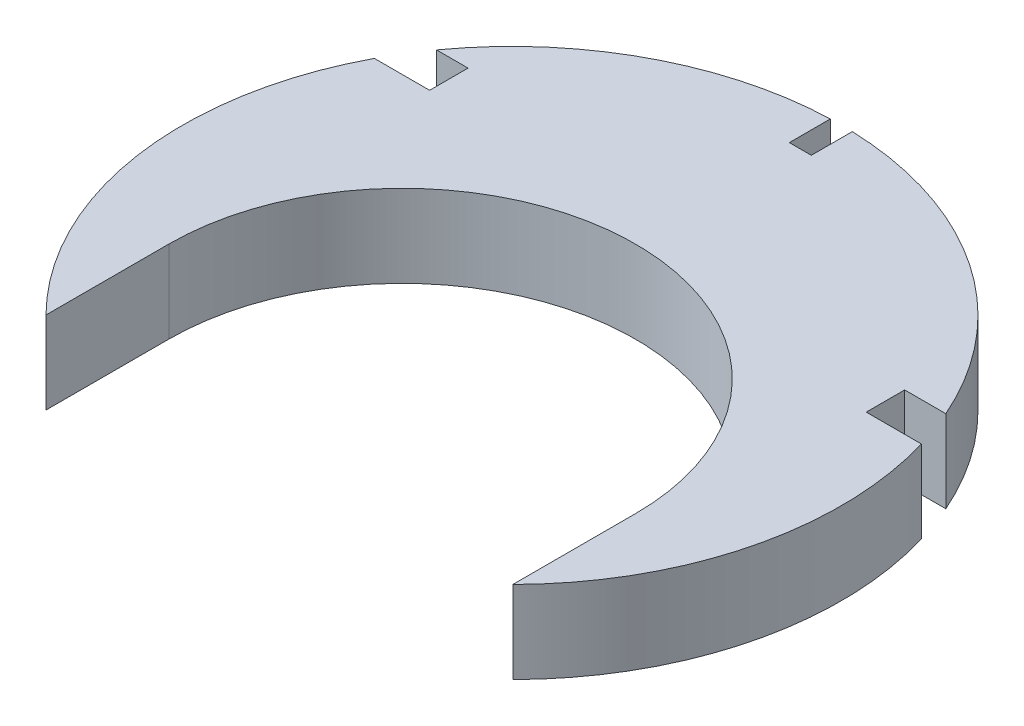
ISO-10303-21;
HEADER;
FILE_DESCRIPTION(('STEP AP214'),'2;1');
FILE_NAME('part.step','',(''),(''),'','','');
FILE_SCHEMA(('AUTOMOTIVE_DESIGN { 1 0 10303 214 1 1 1 1 }'));
ENDSEC;
DATA;
#1=APPLICATION_CONTEXT('core data for automotive mechanical design processes');
#2=APPLICATION_PROTOCOL_DEFINITION('international standard','automotive_design',2000,#1);
#3=PRODUCT_CONTEXT('',#1,'mechanical');
#4=PRODUCT('Part','Part','',(#3));
#5=PRODUCT_RELATED_PRODUCT_CATEGORY('part','',(#4));
#6=PRODUCT_DEFINITION_FORMATION('','',#4);
#7=PRODUCT_DEFINITION_CONTEXT('part definition',#1,'design');
#8=PRODUCT_DEFINITION('design','',#6,#7);
#9=PRODUCT_DEFINITION_SHAPE('','',#8);
#10=(LENGTH_UNIT() NAMED_UNIT(*) SI_UNIT(.MILLI.,.METRE.));
#11=(NAMED_UNIT(*) PLANE_ANGLE_UNIT() SI_UNIT($,.RADIAN.));
#12=(NAMED_UNIT(*) SI_UNIT($,.STERADIAN.) SOLID_ANGLE_UNIT());
#13=UNCERTAINTY_MEASURE_WITH_UNIT(LENGTH_MEASURE(1.E-05),#10,'distance_accuracy_value','');
#14=(GEOMETRIC_REPRESENTATION_CONTEXT(3) GLOBAL_UNCERTAINTY_ASSIGNED_CONTEXT((#13)) GLOBAL_UNIT_ASSIGNED_CONTEXT((#10,
#11,#12)) REPRESENTATION_CONTEXT('',''));
#15=CARTESIAN_POINT('',(0.,0.,0.));
#16=DIRECTION('',(0.,0.,1.));
#17=DIRECTION('',(1.,0.,0.));
#18=AXIS2_PLACEMENT_3D('',#15,#16,#17);
#19=CARTESIAN_POINT('',(0.,6.6,0.));
#20=DIRECTION('',(0.,-1.,0.));
#21=DIRECTION('',(0.,0.,-1.));
#22=AXIS2_PLACEMENT_3D('',#19,#20,#21);
#23=CYLINDRICAL_SURFACE('',#22,12.);
#24=CARTESIAN_POINT('',(0.,3.6,0.));
#25=DIRECTION('',(0.,1.,0.));
#26=DIRECTION('',(0.,0.,1.));
#27=AXIS2_PLACEMENT_3D('',#24,#25,#26);
#28=CIRCLE('',#27,12.);
#29=CARTESIAN_POINT('',(10.998181667894,3.6,-4.8));
#30=VERTEX_POINT('',#29);
#31=CARTESIAN_POINT('',(0.400000000000038,3.6,-11.993331480452));
#32=VERTEX_POINT('',#31);
#33=EDGE_CURVE('E179',#30,#32,#28,.T.);
#34=ORIENTED_EDGE('',*,*,#33,.T.);
#35=DIRECTION('',(0.,-1.,0.));
#36=VECTOR('',#35,1.);
#37=CARTESIAN_POINT('',(0.400000000000038,6.6,-11.993331480452));
#38=LINE('',#37,#36);
#39=CARTESIAN_POINT('',(0.400000000000038,6.6,-11.993331480452));
#40=VERTEX_POINT('',#39);
#41=EDGE_CURVE('E11',#40,#32,#38,.T.);
#42=ORIENTED_EDGE('',*,*,#41,.F.);
#43=CARTESIAN_POINT('',(0.,6.6,0.));
#44=DIRECTION('',(0.,1.,0.));
#45=DIRECTION('',(0.,0.,1.));
#46=AXIS2_PLACEMENT_3D('',#43,#44,#45);
#47=CIRCLE('',#46,12.);
#48=CARTESIAN_POINT('',(10.998181667894,6.6,-4.8));
#49=VERTEX_POINT('',#48);
#50=EDGE_CURVE('E215',#49,#40,#47,.T.);
#51=ORIENTED_EDGE('',*,*,#50,.F.);
#52=DIRECTION('',(0.,-1.,0.));
#53=VECTOR('',#52,1.);
#54=CARTESIAN_POINT('',(10.998181667894,6.6,-4.8));
#55=LINE('',#54,#53);
#56=EDGE_CURVE('E175',#49,#30,#55,.T.);
#57=ORIENTED_EDGE('',*,*,#56,.T.);
#58=EDGE_LOOP('',(#34,#42,#51,#57));
#59=FACE_BOUND('',#58,.T.);
#60=ADVANCED_FACE('F35',(#59),#23,.T.);
#61=CARTESIAN_POINT('',(0.400000000000038,6.6,0.));
#62=DIRECTION('',(1.,0.,0.));
#63=DIRECTION('',(0.,0.,-1.));
#64=AXIS2_PLACEMENT_3D('',#61,#62,#63);
#65=PLANE('',#64);
#66=DIRECTION('',(0.,0.,1.));
#67=VECTOR('',#66,1.);
#68=CARTESIAN_POINT('',(0.400000000000038,3.6,0.));
#69=LINE('',#68,#67);
#70=CARTESIAN_POINT('',(0.400000000000038,3.6,-10.5));
#71=VERTEX_POINT('',#70);
#72=EDGE_CURVE('E182',#32,#71,#69,.T.);
#73=ORIENTED_EDGE('',*,*,#72,.T.);
#74=DIRECTION('',(0.,-1.,0.));
#75=VECTOR('',#74,1.);
#76=CARTESIAN_POINT('',(0.400000000000038,6.6,-10.5));
#77=LINE('',#76,#75);
#78=CARTESIAN_POINT('',(0.400000000000038,6.6,-10.5));
#79=VERTEX_POINT('',#78);
#80=EDGE_CURVE('E43',#79,#71,#77,.T.);
#81=ORIENTED_EDGE('',*,*,#80,.F.);
#82=DIRECTION('',(0.,0.,1.));
#83=VECTOR('',#82,1.);
#84=CARTESIAN_POINT('',(0.400000000000038,6.6,0.));
#85=LINE('',#84,#83);
#86=EDGE_CURVE('E118',#40,#79,#85,.T.);
#87=ORIENTED_EDGE('',*,*,#86,.F.);
#88=ORIENTED_EDGE('',*,*,#41,.T.);
#89=EDGE_LOOP('',(#73,#81,#87,#88));
#90=FACE_BOUND('',#89,.T.);
#91=ADVANCED_FACE('F248',(#90),#65,.F.);
#92=CARTESIAN_POINT('',(0.,6.6,-10.5));
#93=DIRECTION('',(0.,0.,-1.));
#94=DIRECTION('',(-1.,0.,0.));
#95=AXIS2_PLACEMENT_3D('',#92,#93,#94);
#96=PLANE('',#95);
#97=DIRECTION('',(1.,0.,0.));
#98=VECTOR('',#97,1.);
#99=CARTESIAN_POINT('',(0.,3.6,-10.5));
#100=LINE('',#99,#98);
#101=CARTESIAN_POINT('',(-0.399999999999965,3.6,-10.5));
#102=VERTEX_POINT('',#101);
#103=EDGE_CURVE('E185',#102,#71,#100,.T.);
#104=ORIENTED_EDGE('',*,*,#103,.F.);
#105=DIRECTION('',(0.,-1.,0.));
#106=VECTOR('',#105,1.);
#107=CARTESIAN_POINT('',(-0.399999999999965,6.6,-10.5));
#108=LINE('',#107,#106);
#109=CARTESIAN_POINT('',(-0.399999999999965,6.6,-10.5));
#110=VERTEX_POINT('',#109);
#111=EDGE_CURVE('E241',#110,#102,#108,.T.);
#112=ORIENTED_EDGE('',*,*,#111,.F.);
#113=DIRECTION('',(1.,0.,0.));
#114=VECTOR('',#113,1.);
#115=CARTESIAN_POINT('',(0.,6.6,-10.5));
#116=LINE('',#115,#114);
#117=EDGE_CURVE('E247',#110,#79,#116,.T.);
#118=ORIENTED_EDGE('',*,*,#117,.T.);
#119=ORIENTED_EDGE('',*,*,#80,.T.);
#120=EDGE_LOOP('',(#104,#112,#118,#119));
#121=FACE_BOUND('',#120,.T.);
#122=ADVANCED_FACE('F245',(#121),#96,.T.);
#123=CARTESIAN_POINT('',(-0.399999999999965,6.6,0.));
#124=DIRECTION('',(-1.,0.,0.));
#125=DIRECTION('',(0.,0.,1.));
#126=AXIS2_PLACEMENT_3D('',#123,#124,#125);
#127=PLANE('',#126);
#128=DIRECTION('',(0.,0.,-1.));
#129=VECTOR('',#128,1.);
#130=CARTESIAN_POINT('',(-0.399999999999965,3.6,0.));
#131=LINE('',#130,#129);
#132=CARTESIAN_POINT('',(-0.399999999999965,3.6,-11.993331480452));
#133=VERTEX_POINT('',#132);
#134=EDGE_CURVE('E188',#102,#133,#131,.T.);
#135=ORIENTED_EDGE('',*,*,#134,.T.);
#136=DIRECTION('',(0.,-1.,0.));
#137=VECTOR('',#136,1.);
#138=CARTESIAN_POINT('',(-0.399999999999965,6.6,-11.993331480452));
#139=LINE('',#138,#137);
#140=CARTESIAN_POINT('',(-0.399999999999965,6.6,-11.993331480452));
#141=VERTEX_POINT('',#140);
#142=EDGE_CURVE('E238',#141,#133,#139,.T.);
#143=ORIENTED_EDGE('',*,*,#142,.F.);
#144=DIRECTION('',(0.,0.,-1.));
#145=VECTOR('',#144,1.);
#146=CARTESIAN_POINT('',(-0.399999999999965,6.6,0.));
#147=LINE('',#146,#145);
#148=EDGE_CURVE('E267',#110,#141,#147,.T.);
#149=ORIENTED_EDGE('',*,*,#148,.F.);
#150=ORIENTED_EDGE('',*,*,#111,.T.);
#151=EDGE_LOOP('',(#135,#143,#149,#150));
#152=FACE_BOUND('',#151,.T.);
#153=ADVANCED_FACE('F257',(#152),#127,.F.);
#154=CARTESIAN_POINT('',(0.,6.6,0.));
#155=DIRECTION('',(0.,-1.,0.));
#156=DIRECTION('',(0.,0.,-1.));
#157=AXIS2_PLACEMENT_3D('',#154,#155,#156);
#158=CYLINDRICAL_SURFACE('',#157,12.);
#159=CARTESIAN_POINT('',(0.,3.6,0.));
#160=DIRECTION('',(0.,1.,0.));
#161=DIRECTION('',(0.,0.,1.));
#162=AXIS2_PLACEMENT_3D('',#159,#160,#161);
#163=CIRCLE('',#162,12.);
#164=CARTESIAN_POINT('',(-9.74679434480893,3.6,-7.));
#165=VERTEX_POINT('',#164);
#166=EDGE_CURVE('E190',#133,#165,#163,.T.);
#167=ORIENTED_EDGE('',*,*,#166,.T.);
#168=DIRECTION('',(0.,-1.,0.));
#169=VECTOR('',#168,1.);
#170=CARTESIAN_POINT('',(-9.74679434480893,6.6,-7.));
#171=LINE('',#170,#169);
#172=CARTESIAN_POINT('',(-9.74679434480893,6.6,-7.));
#173=VERTEX_POINT('',#172);
#174=EDGE_CURVE('E236',#173,#165,#171,.T.);
#175=ORIENTED_EDGE('',*,*,#174,.F.);
#176=CARTESIAN_POINT('',(0.,6.6,0.));
#177=DIRECTION('',(0.,1.,0.));
#178=DIRECTION('',(0.,0.,1.));
#179=AXIS2_PLACEMENT_3D('',#176,#177,#178);
#180=CIRCLE('',#179,12.);
#181=EDGE_CURVE('E263',#141,#173,#180,.T.);
#182=ORIENTED_EDGE('',*,*,#181,.F.);
#183=ORIENTED_EDGE('',*,*,#142,.T.);
#184=EDGE_LOOP('',(#167,#175,#182,#183));
#185=FACE_BOUND('',#184,.T.);
#186=ADVANCED_FACE('F261',(#185),#158,.T.);
#187=CARTESIAN_POINT('',(0.,6.6,-7.));
#188=DIRECTION('',(0.,0.,1.));
#189=DIRECTION('',(1.,0.,0.));
#190=AXIS2_PLACEMENT_3D('',#187,#188,#189);
#191=PLANE('',#190);
#192=DIRECTION('',(-1.,0.,0.));
#193=VECTOR('',#192,1.);
#194=CARTESIAN_POINT('',(0.,3.6,-7.));
#195=LINE('',#194,#193);
#196=CARTESIAN_POINT('',(-8.59999999999997,3.6,-7.));
#197=VERTEX_POINT('',#196);
#198=EDGE_CURVE('E193',#197,#165,#195,.T.);
#199=ORIENTED_EDGE('',*,*,#198,.F.);
#200=DIRECTION('',(0.,-1.,0.));
#201=VECTOR('',#200,1.);
#202=CARTESIAN_POINT('',(-8.59999999999997,6.6,-7.));
#203=LINE('',#202,#201);
#204=CARTESIAN_POINT('',(-8.59999999999997,6.6,-7.));
#205=VERTEX_POINT('',#204);
#206=EDGE_CURVE('E234',#205,#197,#203,.T.);
#207=ORIENTED_EDGE('',*,*,#206,.F.);
#208=DIRECTION('',(-1.,0.,0.));
#209=VECTOR('',#208,1.);
#210=CARTESIAN_POINT('',(0.,6.6,-7.));
#211=LINE('',#210,#209);
#212=EDGE_CURVE('E266',#205,#173,#211,.T.);
#213=ORIENTED_EDGE('',*,*,#212,.T.);
#214=ORIENTED_EDGE('',*,*,#174,.T.);
#215=EDGE_LOOP('',(#199,#207,#213,#214));
#216=FACE_BOUND('',#215,.T.);
#217=ADVANCED_FACE('F320',(#216),#191,.T.);
#218=CARTESIAN_POINT('',(-8.59999999999997,6.6,0.));
#219=DIRECTION('',(1.,0.,0.));
#220=DIRECTION('',(0.,0.,-1.));
#221=AXIS2_PLACEMENT_3D('',#218,#219,#220);
#222=PLANE('',#221);
#223=DIRECTION('',(0.,0.,1.));
#224=VECTOR('',#223,1.);
#225=CARTESIAN_POINT('',(-8.59999999999997,3.6,0.));
#226=LINE('',#225,#224);
#227=CARTESIAN_POINT('',(-8.59999999999997,3.6,-5.6));
#228=VERTEX_POINT('',#227);
#229=EDGE_CURVE('E196',#197,#228,#226,.T.);
#230=ORIENTED_EDGE('',*,*,#229,.T.);
#231=DIRECTION('',(0.,-1.,0.));
#232=VECTOR('',#231,1.);
#233=CARTESIAN_POINT('',(-8.59999999999997,6.6,-5.6));
#234=LINE('',#233,#232);
#235=CARTESIAN_POINT('',(-8.59999999999997,6.6,-5.6));
#236=VERTEX_POINT('',#235);
#237=EDGE_CURVE('E231',#236,#228,#234,.T.);
#238=ORIENTED_EDGE('',*,*,#237,.F.);
#239=DIRECTION('',(0.,0.,1.));
#240=VECTOR('',#239,1.);
#241=CARTESIAN_POINT('',(-8.59999999999997,6.6,0.));
#242=LINE('',#241,#240);
#243=EDGE_CURVE('E269',#205,#236,#242,.T.);
#244=ORIENTED_EDGE('',*,*,#243,.F.);
#245=ORIENTED_EDGE('',*,*,#206,.T.);
#246=EDGE_LOOP('',(#230,#238,#244,#245));
#247=FACE_BOUND('',#246,.T.);
#248=ADVANCED_FACE('F323',(#247),#222,.F.);
#249=CARTESIAN_POINT('',(0.,6.6,-5.6));
#250=DIRECTION('',(0.,0.,1.));
#251=DIRECTION('',(1.,0.,0.));
#252=AXIS2_PLACEMENT_3D('',#249,#250,#251);
#253=PLANE('',#252);
#254=DIRECTION('',(-1.,0.,0.));
#255=VECTOR('',#254,1.);
#256=CARTESIAN_POINT('',(0.,3.6,-5.6));
#257=LINE('',#256,#255);
#258=CARTESIAN_POINT('',(-10.6131993291373,3.6,-5.6));
#259=VERTEX_POINT('',#258);
#260=EDGE_CURVE('E198',#228,#259,#257,.T.);
#261=ORIENTED_EDGE('',*,*,#260,.T.);
#262=DIRECTION('',(0.,-1.,0.));
#263=VECTOR('',#262,1.);
#264=CARTESIAN_POINT('',(-10.6131993291373,6.6,-5.6));
#265=LINE('',#264,#263);
#266=CARTESIAN_POINT('',(-10.6131993291373,6.6,-5.6));
#267=VERTEX_POINT('',#266);
#268=EDGE_CURVE('E228',#267,#259,#265,.T.);
#269=ORIENTED_EDGE('',*,*,#268,.F.);
#270=DIRECTION('',(-1.,0.,0.));
#271=VECTOR('',#270,1.);
#272=CARTESIAN_POINT('',(0.,6.6,-5.6));
#273=LINE('',#272,#271);
#274=EDGE_CURVE('E275',#236,#267,#273,.T.);
#275=ORIENTED_EDGE('',*,*,#274,.F.);
#276=ORIENTED_EDGE('',*,*,#237,.T.);
#277=EDGE_LOOP('',(#261,#269,#275,#276));
#278=FACE_BOUND('',#277,.T.);
#279=ADVANCED_FACE('F327',(#278),#253,.F.);
#280=CARTESIAN_POINT('',(0.,6.6,0.));
#281=DIRECTION('',(0.,-1.,0.));
#282=DIRECTION('',(0.,0.,-1.));
#283=AXIS2_PLACEMENT_3D('',#280,#281,#282);
#284=CYLINDRICAL_SURFACE('',#283,12.);
#285=CARTESIAN_POINT('',(0.,3.6,0.));
#286=DIRECTION('',(0.,1.,0.));
#287=DIRECTION('',(0.,0.,1.));
#288=AXIS2_PLACEMENT_3D('',#285,#286,#287);
#289=CIRCLE('',#288,12.);
#290=CARTESIAN_POINT('',(-8.49999999999999,3.6,8.47053717304876));
#291=VERTEX_POINT('',#290);
#292=EDGE_CURVE('E200',#259,#291,#289,.T.);
#293=ORIENTED_EDGE('',*,*,#292,.T.);
#294=DIRECTION('',(0.,-1.,0.));
#295=VECTOR('',#294,1.);
#296=CARTESIAN_POINT('',(-8.49999999999999,6.6,8.47053717304876));
#297=LINE('',#296,#295);
#298=CARTESIAN_POINT('',(-8.49999999999999,6.6,8.47053717304876));
#299=VERTEX_POINT('',#298);
#300=EDGE_CURVE('E226',#299,#291,#297,.T.);
#301=ORIENTED_EDGE('',*,*,#300,.F.);
#302=CARTESIAN_POINT('',(0.,6.6,0.));
#303=DIRECTION('',(0.,1.,0.));
#304=DIRECTION('',(0.,0.,1.));
#305=AXIS2_PLACEMENT_3D('',#302,#303,#304);
#306=CIRCLE('',#305,12.);
#307=EDGE_CURVE('E277',#267,#299,#306,.T.);
#308=ORIENTED_EDGE('',*,*,#307,.F.);
#309=ORIENTED_EDGE('',*,*,#268,.T.);
#310=EDGE_LOOP('',(#293,#301,#308,#309));
#311=FACE_BOUND('',#310,.T.);
#312=ADVANCED_FACE('F331',(#311),#284,.T.);
#313=CARTESIAN_POINT('',(-8.49999999999999,6.6,0.));
#314=DIRECTION('',(1.,0.,0.));
#315=DIRECTION('',(0.,0.,-1.));
#316=AXIS2_PLACEMENT_3D('',#313,#314,#315);
#317=PLANE('',#316);
#318=DIRECTION('',(0.,0.,1.));
#319=VECTOR('',#318,1.);
#320=CARTESIAN_POINT('',(-8.49999999999999,3.6,0.));
#321=LINE('',#320,#319);
#322=CARTESIAN_POINT('',(-8.49999999999999,3.6,4.));
#323=VERTEX_POINT('',#322);
#324=EDGE_CURVE('E203',#323,#291,#321,.T.);
#325=ORIENTED_EDGE('',*,*,#324,.F.);
#326=DIRECTION('',(0.,-1.,0.));
#327=VECTOR('',#326,1.);
#328=CARTESIAN_POINT('',(-8.49999999999999,6.6,4.));
#329=LINE('',#328,#327);
#330=CARTESIAN_POINT('',(-8.49999999999999,6.6,4.));
#331=VERTEX_POINT('',#330);
#332=EDGE_CURVE('E224',#331,#323,#329,.T.);
#333=ORIENTED_EDGE('',*,*,#332,.F.);
#334=DIRECTION('',(0.,0.,1.));
#335=VECTOR('',#334,1.);
#336=CARTESIAN_POINT('',(-8.49999999999999,6.6,0.));
#337=LINE('',#336,#335);
#338=EDGE_CURVE('E279',#331,#299,#337,.T.);
#339=ORIENTED_EDGE('',*,*,#338,.T.);
#340=ORIENTED_EDGE('',*,*,#300,.T.);
#341=EDGE_LOOP('',(#325,#333,#339,#340));
#342=FACE_BOUND('',#341,.T.);
#343=ADVANCED_FACE('F333',(#342),#317,.T.);
#344=CARTESIAN_POINT('',(0.,6.6,4.));
#345=DIRECTION('',(0.,-1.,0.));
#346=DIRECTION('',(0.,0.,-1.));
#347=AXIS2_PLACEMENT_3D('',#344,#345,#346);
#348=CYLINDRICAL_SURFACE('',#347,8.5);
#349=CARTESIAN_POINT('',(0.,3.6,4.));
#350=DIRECTION('',(0.,1.,0.));
#351=DIRECTION('',(0.,0.,1.));
#352=AXIS2_PLACEMENT_3D('',#349,#350,#351);
#353=CIRCLE('',#352,8.5);
#354=CARTESIAN_POINT('',(8.50000000000001,3.6,4.));
#355=VERTEX_POINT('',#354);
#356=EDGE_CURVE('E207',#355,#323,#353,.T.);
#357=ORIENTED_EDGE('',*,*,#356,.F.);
#358=DIRECTION('',(0.,-1.,0.));
#359=VECTOR('',#358,1.);
#360=CARTESIAN_POINT('',(8.50000000000001,6.6,4.));
#361=LINE('',#360,#359);
#362=CARTESIAN_POINT('',(8.50000000000001,6.6,4.));
#363=VERTEX_POINT('',#362);
#364=EDGE_CURVE('E222',#363,#355,#361,.T.);
#365=ORIENTED_EDGE('',*,*,#364,.F.);
#366=CARTESIAN_POINT('',(0.,6.6,4.));
#367=DIRECTION('',(0.,1.,0.));
#368=DIRECTION('',(0.,0.,1.));
#369=AXIS2_PLACEMENT_3D('',#366,#367,#368);
#370=CIRCLE('',#369,8.5);
#371=EDGE_CURVE('E282',#363,#331,#370,.T.);
#372=ORIENTED_EDGE('',*,*,#371,.T.);
#373=ORIENTED_EDGE('',*,*,#332,.T.);
#374=EDGE_LOOP('',(#357,#365,#372,#373));
#375=FACE_BOUND('',#374,.T.);
#376=ADVANCED_FACE('F336',(#375),#348,.F.);
#377=CARTESIAN_POINT('',(8.50000000000001,6.6,0.));
#378=DIRECTION('',(1.,0.,0.));
#379=DIRECTION('',(0.,0.,-1.));
#380=AXIS2_PLACEMENT_3D('',#377,#378,#379);
#381=PLANE('',#380);
#382=DIRECTION('',(0.,0.,1.));
#383=VECTOR('',#382,1.);
#384=CARTESIAN_POINT('',(8.50000000000001,3.6,0.));
#385=LINE('',#384,#383);
#386=CARTESIAN_POINT('',(8.50000000000001,3.6,8.47053717304875));
#387=VERTEX_POINT('',#386);
#388=EDGE_CURVE('E210',#355,#387,#385,.T.);
#389=ORIENTED_EDGE('',*,*,#388,.T.);
#390=DIRECTION('',(0.,-1.,0.));
#391=VECTOR('',#390,1.);
#392=CARTESIAN_POINT('',(8.50000000000001,6.6,8.47053717304875));
#393=LINE('',#392,#391);
#394=CARTESIAN_POINT('',(8.50000000000001,6.6,8.47053717304875));
#395=VERTEX_POINT('',#394);
#396=EDGE_CURVE('E219',#395,#387,#393,.T.);
#397=ORIENTED_EDGE('',*,*,#396,.F.);
#398=DIRECTION('',(0.,0.,1.));
#399=VECTOR('',#398,1.);
#400=CARTESIAN_POINT('',(8.50000000000001,6.6,0.));
#401=LINE('',#400,#399);
#402=EDGE_CURVE('E284',#363,#395,#401,.T.);
#403=ORIENTED_EDGE('',*,*,#402,.F.);
#404=ORIENTED_EDGE('',*,*,#364,.T.);
#405=EDGE_LOOP('',(#389,#397,#403,#404));
#406=FACE_BOUND('',#405,.T.);
#407=ADVANCED_FACE('F290',(#406),#381,.F.);
#408=CARTESIAN_POINT('',(11.5082579046527,3.6,-3.4));
#409=VERTEX_POINT('',#408);
#410=EDGE_CURVE('E204',#387,#409,#289,.T.);
#411=ORIENTED_EDGE('',*,*,#410,.T.);
#412=DIRECTION('',(0.,-1.,0.));
#413=VECTOR('',#412,1.);
#414=CARTESIAN_POINT('',(11.5082579046527,6.6,-3.4));
#415=LINE('',#414,#413);
#416=CARTESIAN_POINT('',(11.5082579046527,6.6,-3.4));
#417=VERTEX_POINT('',#416);
#418=EDGE_CURVE('E170',#417,#409,#415,.T.);
#419=ORIENTED_EDGE('',*,*,#418,.F.);
#420=EDGE_CURVE('E161',#395,#417,#306,.T.);
#421=ORIENTED_EDGE('',*,*,#420,.F.);
#422=ORIENTED_EDGE('',*,*,#396,.T.);
#423=EDGE_LOOP('',(#411,#419,#421,#422));
#424=FACE_BOUND('',#423,.T.);
#425=ADVANCED_FACE('F294',(#424),#284,.T.);
#426=CARTESIAN_POINT('',(0.,6.6,-3.4));
#427=DIRECTION('',(0.,0.,1.));
#428=DIRECTION('',(1.,0.,0.));
#429=AXIS2_PLACEMENT_3D('',#426,#427,#428);
#430=PLANE('',#429);
#431=DIRECTION('',(-1.,0.,0.));
#432=VECTOR('',#431,1.);
#433=CARTESIAN_POINT('',(0.,3.6,-3.4));
#434=LINE('',#433,#432);
#435=CARTESIAN_POINT('',(9.50000000000004,3.6,-3.4));
#436=VERTEX_POINT('',#435);
#437=EDGE_CURVE('E169',#409,#436,#434,.T.);
#438=ORIENTED_EDGE('',*,*,#437,.T.);
#439=DIRECTION('',(0.,-1.,0.));
#440=VECTOR('',#439,1.);
#441=CARTESIAN_POINT('',(9.50000000000004,6.6,-3.4));
#442=LINE('',#441,#440);
#443=CARTESIAN_POINT('',(9.50000000000004,6.6,-3.4));
#444=VERTEX_POINT('',#443);
#445=EDGE_CURVE('E166',#444,#436,#442,.T.);
#446=ORIENTED_EDGE('',*,*,#445,.F.);
#447=DIRECTION('',(-1.,0.,0.));
#448=VECTOR('',#447,1.);
#449=CARTESIAN_POINT('',(0.,6.6,-3.4));
#450=LINE('',#449,#448);
#451=EDGE_CURVE('E155',#417,#444,#450,.T.);
#452=ORIENTED_EDGE('',*,*,#451,.F.);
#453=ORIENTED_EDGE('',*,*,#418,.T.);
#454=EDGE_LOOP('',(#438,#446,#452,#453));
#455=FACE_BOUND('',#454,.T.);
#456=ADVANCED_FACE('F167',(#455),#430,.F.);
#457=CARTESIAN_POINT('',(9.50000000000004,6.6,0.));
#458=DIRECTION('',(-1.,0.,0.));
#459=DIRECTION('',(0.,0.,1.));
#460=AXIS2_PLACEMENT_3D('',#457,#458,#459);
#461=PLANE('',#460);
#462=DIRECTION('',(0.,0.,-1.));
#463=VECTOR('',#462,1.);
#464=CARTESIAN_POINT('',(9.50000000000004,3.6,0.));
#465=LINE('',#464,#463);
#466=CARTESIAN_POINT('',(9.50000000000004,3.6,-4.8));
#467=VERTEX_POINT('',#466);
#468=EDGE_CURVE('E104',#436,#467,#465,.T.);
#469=ORIENTED_EDGE('',*,*,#468,.T.);
#470=DIRECTION('',(0.,-1.,0.));
#471=VECTOR('',#470,1.);
#472=CARTESIAN_POINT('',(9.50000000000004,6.6,-4.8));
#473=LINE('',#472,#471);
#474=CARTESIAN_POINT('',(9.50000000000004,6.6,-4.8));
#475=VERTEX_POINT('',#474);
#476=EDGE_CURVE('E171',#475,#467,#473,.T.);
#477=ORIENTED_EDGE('',*,*,#476,.F.);
#478=DIRECTION('',(0.,0.,-1.));
#479=VECTOR('',#478,1.);
#480=CARTESIAN_POINT('',(9.50000000000004,6.6,0.));
#481=LINE('',#480,#479);
#482=EDGE_CURVE('E159',#444,#475,#481,.T.);
#483=ORIENTED_EDGE('',*,*,#482,.F.);
#484=ORIENTED_EDGE('',*,*,#445,.T.);
#485=EDGE_LOOP('',(#469,#477,#483,#484));
#486=FACE_BOUND('',#485,.T.);
#487=ADVANCED_FACE('F173',(#486),#461,.F.);
#488=CARTESIAN_POINT('',(0.,6.6,-4.8));
#489=DIRECTION('',(0.,0.,-1.));
#490=DIRECTION('',(-1.,0.,0.));
#491=AXIS2_PLACEMENT_3D('',#488,#489,#490);
#492=PLANE('',#491);
#493=DIRECTION('',(1.,0.,0.));
#494=VECTOR('',#493,1.);
#495=CARTESIAN_POINT('',(0.,3.6,-4.8));
#496=LINE('',#495,#494);
#497=EDGE_CURVE('E110',#467,#30,#496,.T.);
#498=ORIENTED_EDGE('',*,*,#497,.T.);
#499=ORIENTED_EDGE('',*,*,#56,.F.);
#500=DIRECTION('',(1.,0.,0.));
#501=VECTOR('',#500,1.);
#502=CARTESIAN_POINT('',(0.,6.6,-4.8));
#503=LINE('',#502,#501);
#504=EDGE_CURVE('E51',#475,#49,#503,.T.);
#505=ORIENTED_EDGE('',*,*,#504,.F.);
#506=ORIENTED_EDGE('',*,*,#476,.T.);
#507=EDGE_LOOP('',(#498,#499,#505,#506));
#508=FACE_BOUND('',#507,.T.);
#509=ADVANCED_FACE('F297',(#508),#492,.F.);
#510=CARTESIAN_POINT('',(0.,6.6,0.));
#511=DIRECTION('',(0.,1.,0.));
#512=DIRECTION('',(0.,0.,1.));
#513=AXIS2_PLACEMENT_3D('',#510,#511,#512);
#514=PLANE('',#513);
#515=ORIENTED_EDGE('',*,*,#50,.T.);
#516=ORIENTED_EDGE('',*,*,#86,.T.);
#517=ORIENTED_EDGE('',*,*,#117,.F.);
#518=ORIENTED_EDGE('',*,*,#148,.T.);
#519=ORIENTED_EDGE('',*,*,#181,.T.);
#520=ORIENTED_EDGE('',*,*,#212,.F.);
#521=ORIENTED_EDGE('',*,*,#243,.T.);
#522=ORIENTED_EDGE('',*,*,#274,.T.);
#523=ORIENTED_EDGE('',*,*,#307,.T.);
#524=ORIENTED_EDGE('',*,*,#338,.F.);
#525=ORIENTED_EDGE('',*,*,#371,.F.);
#526=ORIENTED_EDGE('',*,*,#402,.T.);
#527=ORIENTED_EDGE('',*,*,#420,.T.);
#528=ORIENTED_EDGE('',*,*,#451,.T.);
#529=ORIENTED_EDGE('',*,*,#482,.T.);
#530=ORIENTED_EDGE('',*,*,#504,.T.);
#531=EDGE_LOOP('',(#515,#516,#517,#518,#519,#520,#521,#522,#523,#524,#525,#526,#527,#528,#529,#530));
#532=FACE_BOUND('',#531,.T.);
#533=ADVANCED_FACE('F157',(#532),#514,.T.);
#534=CARTESIAN_POINT('',(0.,3.6,0.));
#535=DIRECTION('',(0.,1.,0.));
#536=DIRECTION('',(0.,0.,1.));
#537=AXIS2_PLACEMENT_3D('',#534,#535,#536);
#538=PLANE('',#537);
#539=ORIENTED_EDGE('',*,*,#33,.F.);
#540=ORIENTED_EDGE('',*,*,#497,.F.);
#541=ORIENTED_EDGE('',*,*,#468,.F.);
#542=ORIENTED_EDGE('',*,*,#437,.F.);
#543=ORIENTED_EDGE('',*,*,#410,.F.);
#544=ORIENTED_EDGE('',*,*,#388,.F.);
#545=ORIENTED_EDGE('',*,*,#356,.T.);
#546=ORIENTED_EDGE('',*,*,#324,.T.);
#547=ORIENTED_EDGE('',*,*,#292,.F.);
#548=ORIENTED_EDGE('',*,*,#260,.F.);
#549=ORIENTED_EDGE('',*,*,#229,.F.);
#550=ORIENTED_EDGE('',*,*,#198,.T.);
#551=ORIENTED_EDGE('',*,*,#166,.F.);
#552=ORIENTED_EDGE('',*,*,#134,.F.);
#553=ORIENTED_EDGE('',*,*,#103,.T.);
#554=ORIENTED_EDGE('',*,*,#72,.F.);
#555=EDGE_LOOP('',(#539,#540,#541,#542,#543,#544,#545,#546,#547,#548,#549,#550,#551,#552,#553,#554));
#556=FACE_BOUND('',#555,.T.);
#557=ADVANCED_FACE('F253',(#556),#538,.F.);
#558=CLOSED_SHELL('',(#60,#91,#122,#153,#186,#217,#248,#279,#312,#343,#376,#407,#425,#456,#487,
#509,#533,#557));
#559=MANIFOLD_SOLID_BREP('B2',#558);
#560=ADVANCED_BREP_SHAPE_REPRESENTATION('',(#18,#559),#14);
#561=SHAPE_DEFINITION_REPRESENTATION(#9,#560);
ENDSEC;
END-ISO-10303-21;
